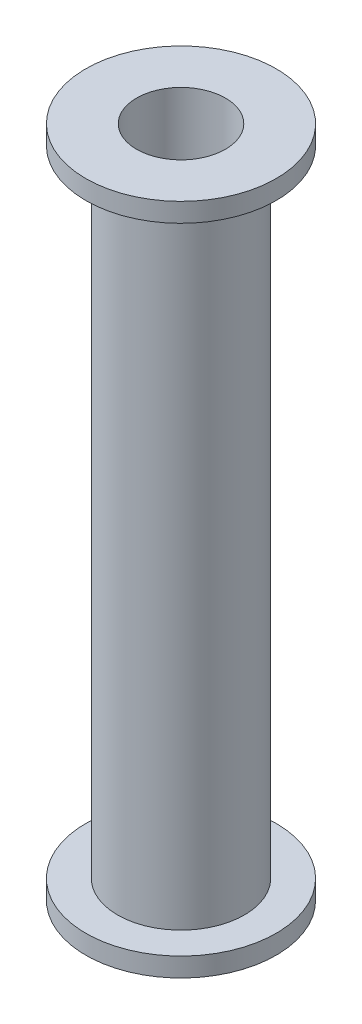
ISO-10303-21;
HEADER;
FILE_DESCRIPTION(('STEP AP214'),'2;1');
FILE_NAME('part.step','',(''),(''),'','','');
FILE_SCHEMA(('AUTOMOTIVE_DESIGN { 1 0 10303 214 1 1 1 1 }'));
ENDSEC;
DATA;
#1=APPLICATION_CONTEXT('core data for automotive mechanical design processes');
#2=APPLICATION_PROTOCOL_DEFINITION('international standard','automotive_design',2000,#1);
#3=PRODUCT_CONTEXT('',#1,'mechanical');
#4=PRODUCT('Part','Part','',(#3));
#5=PRODUCT_RELATED_PRODUCT_CATEGORY('part','',(#4));
#6=PRODUCT_DEFINITION_FORMATION('','',#4);
#7=PRODUCT_DEFINITION_CONTEXT('part definition',#1,'design');
#8=PRODUCT_DEFINITION('design','',#6,#7);
#9=PRODUCT_DEFINITION_SHAPE('','',#8);
#10=(LENGTH_UNIT() NAMED_UNIT(*) SI_UNIT(.MILLI.,.METRE.));
#11=(NAMED_UNIT(*) PLANE_ANGLE_UNIT() SI_UNIT($,.RADIAN.));
#12=(NAMED_UNIT(*) SI_UNIT($,.STERADIAN.) SOLID_ANGLE_UNIT());
#13=UNCERTAINTY_MEASURE_WITH_UNIT(LENGTH_MEASURE(1.E-05),#10,'distance_accuracy_value','');
#14=(GEOMETRIC_REPRESENTATION_CONTEXT(3) GLOBAL_UNCERTAINTY_ASSIGNED_CONTEXT((#13)) GLOBAL_UNIT_ASSIGNED_CONTEXT((#10,
#11,#12)) REPRESENTATION_CONTEXT('',''));
#15=CARTESIAN_POINT('',(0.,0.,0.));
#16=DIRECTION('',(0.,0.,1.));
#17=DIRECTION('',(1.,0.,0.));
#18=AXIS2_PLACEMENT_3D('',#15,#16,#17);
#19=CARTESIAN_POINT('',(0.,2.65,0.));
#20=DIRECTION('',(0.,1.,0.));
#21=DIRECTION('',(0.,0.,1.));
#22=AXIS2_PLACEMENT_3D('',#19,#20,#21);
#23=CYLINDRICAL_SURFACE('',#22,0.7);
#24=CARTESIAN_POINT('',(0.,5.3,0.));
#25=DIRECTION('',(0.,1.,0.));
#26=DIRECTION('',(0.,0.,1.));
#27=AXIS2_PLACEMENT_3D('',#24,#25,#26);
#28=CIRCLE('',#27,0.7);
#29=CARTESIAN_POINT('',(0.,5.3,0.7));
#30=VERTEX_POINT('',#29);
#31=EDGE_CURVE('E41',#30,#30,#28,.F.);
#32=ORIENTED_EDGE('',*,*,#31,.F.);
#33=EDGE_LOOP('',(#32));
#34=FACE_BOUND('',#33,.T.);
#35=CARTESIAN_POINT('',(0.,-5.3,0.));
#36=DIRECTION('',(0.,1.,0.));
#37=DIRECTION('',(0.,0.,1.));
#38=AXIS2_PLACEMENT_3D('',#35,#36,#37);
#39=CIRCLE('',#38,0.7);
#40=CARTESIAN_POINT('',(0.,-5.3,0.7));
#41=VERTEX_POINT('',#40);
#42=EDGE_CURVE('E19',#41,#41,#39,.T.);
#43=ORIENTED_EDGE('',*,*,#42,.F.);
#44=EDGE_LOOP('',(#43));
#45=FACE_BOUND('',#44,.T.);
#46=ADVANCED_FACE('F15',(#34,#45),#23,.F.);
#47=CARTESIAN_POINT('',(1.53,-5.3,-1.53));
#48=DIRECTION('',(0.,-1.,0.));
#49=DIRECTION('',(0.,0.,1.));
#50=AXIS2_PLACEMENT_3D('',#47,#48,#49);
#51=PLANE('',#50);
#52=ORIENTED_EDGE('',*,*,#42,.T.);
#53=EDGE_LOOP('',(#52));
#54=FACE_BOUND('',#53,.T.);
#55=CARTESIAN_POINT('',(0.,-5.3,0.));
#56=DIRECTION('',(0.,-1.,0.));
#57=DIRECTION('',(0.,0.,-1.));
#58=AXIS2_PLACEMENT_3D('',#55,#56,#57);
#59=CIRCLE('',#58,1.5);
#60=CARTESIAN_POINT('',(0.,-5.3,-1.5));
#61=VERTEX_POINT('',#60);
#62=EDGE_CURVE('E39',#61,#61,#59,.F.);
#63=ORIENTED_EDGE('',*,*,#62,.F.);
#64=EDGE_LOOP('',(#63));
#65=FACE_BOUND('',#64,.T.);
#66=ADVANCED_FACE('F48',(#54,#65),#51,.T.);
#67=CARTESIAN_POINT('',(-1.1,5.3,0.));
#68=DIRECTION('',(0.,1.,0.));
#69=DIRECTION('',(0.,0.,1.));
#70=AXIS2_PLACEMENT_3D('',#67,#68,#69);
#71=PLANE('',#70);
#72=ORIENTED_EDGE('',*,*,#31,.T.);
#73=EDGE_LOOP('',(#72));
#74=FACE_BOUND('',#73,.T.);
#75=CARTESIAN_POINT('',(0.,5.3,0.));
#76=DIRECTION('',(0.,1.,0.));
#77=DIRECTION('',(0.,0.,1.));
#78=AXIS2_PLACEMENT_3D('',#75,#76,#77);
#79=CIRCLE('',#78,1.5);
#80=CARTESIAN_POINT('',(0.,5.3,1.5));
#81=VERTEX_POINT('',#80);
#82=EDGE_CURVE('E36',#81,#81,#79,.F.);
#83=ORIENTED_EDGE('',*,*,#82,.F.);
#84=EDGE_LOOP('',(#83));
#85=FACE_BOUND('',#84,.T.);
#86=ADVANCED_FACE('F58',(#74,#85),#71,.T.);
#87=CARTESIAN_POINT('',(0.,-5.,0.));
#88=DIRECTION('',(0.,-1.,0.));
#89=DIRECTION('',(0.,0.,-1.));
#90=AXIS2_PLACEMENT_3D('',#87,#88,#89);
#91=CYLINDRICAL_SURFACE('',#90,1.5);
#92=CARTESIAN_POINT('',(0.,-5.,0.));
#93=DIRECTION('',(0.,-1.,0.));
#94=DIRECTION('',(0.,0.,-1.));
#95=AXIS2_PLACEMENT_3D('',#92,#93,#94);
#96=CIRCLE('',#95,1.5);
#97=CARTESIAN_POINT('',(0.,-5.,-1.5));
#98=VERTEX_POINT('',#97);
#99=EDGE_CURVE('E33',#98,#98,#96,.F.);
#100=ORIENTED_EDGE('',*,*,#99,.F.);
#101=EDGE_LOOP('',(#100));
#102=FACE_BOUND('',#101,.T.);
#103=ORIENTED_EDGE('',*,*,#62,.T.);
#104=EDGE_LOOP('',(#103));
#105=FACE_BOUND('',#104,.T.);
#106=ADVANCED_FACE('F74',(#102,#105),#91,.T.);
#107=CARTESIAN_POINT('',(0.,5.15,0.));
#108=DIRECTION('',(0.,1.,0.));
#109=DIRECTION('',(0.,0.,1.));
#110=AXIS2_PLACEMENT_3D('',#107,#108,#109);
#111=CYLINDRICAL_SURFACE('',#110,1.5);
#112=CARTESIAN_POINT('',(0.,5.,0.));
#113=DIRECTION('',(0.,1.,0.));
#114=DIRECTION('',(0.,0.,1.));
#115=AXIS2_PLACEMENT_3D('',#112,#113,#114);
#116=CIRCLE('',#115,1.5);
#117=CARTESIAN_POINT('',(0.,5.,1.5));
#118=VERTEX_POINT('',#117);
#119=EDGE_CURVE('E28',#118,#118,#116,.F.);
#120=ORIENTED_EDGE('',*,*,#119,.F.);
#121=EDGE_LOOP('',(#120));
#122=FACE_BOUND('',#121,.T.);
#123=ORIENTED_EDGE('',*,*,#82,.T.);
#124=EDGE_LOOP('',(#123));
#125=FACE_BOUND('',#124,.T.);
#126=ADVANCED_FACE('F72',(#122,#125),#111,.T.);
#127=CARTESIAN_POINT('',(1.53,-5.,1.53));
#128=DIRECTION('',(0.,1.,0.));
#129=DIRECTION('',(0.,0.,-1.));
#130=AXIS2_PLACEMENT_3D('',#127,#128,#129);
#131=PLANE('',#130);
#132=CARTESIAN_POINT('',(0.,-5.,0.));
#133=DIRECTION('',(0.,1.,0.));
#134=DIRECTION('',(0.,0.,1.));
#135=AXIS2_PLACEMENT_3D('',#132,#133,#134);
#136=CIRCLE('',#135,1.);
#137=CARTESIAN_POINT('',(0.,-5.,1.));
#138=VERTEX_POINT('',#137);
#139=EDGE_CURVE('E23',#138,#138,#136,.T.);
#140=ORIENTED_EDGE('',*,*,#139,.F.);
#141=EDGE_LOOP('',(#140));
#142=FACE_BOUND('',#141,.T.);
#143=ORIENTED_EDGE('',*,*,#99,.T.);
#144=EDGE_LOOP('',(#143));
#145=FACE_BOUND('',#144,.T.);
#146=ADVANCED_FACE('F17',(#142,#145),#131,.T.);
#147=CARTESIAN_POINT('',(-1.25,5.,0.));
#148=DIRECTION('',(0.,-1.,0.));
#149=DIRECTION('',(0.,0.,-1.));
#150=AXIS2_PLACEMENT_3D('',#147,#148,#149);
#151=PLANE('',#150);
#152=CARTESIAN_POINT('',(0.,5.,0.));
#153=DIRECTION('',(0.,1.,0.));
#154=DIRECTION('',(0.,0.,1.));
#155=AXIS2_PLACEMENT_3D('',#152,#153,#154);
#156=CIRCLE('',#155,1.);
#157=CARTESIAN_POINT('',(0.,5.,1.));
#158=VERTEX_POINT('',#157);
#159=EDGE_CURVE('E10',#158,#158,#156,.F.);
#160=ORIENTED_EDGE('',*,*,#159,.F.);
#161=EDGE_LOOP('',(#160));
#162=FACE_BOUND('',#161,.T.);
#163=ORIENTED_EDGE('',*,*,#119,.T.);
#164=EDGE_LOOP('',(#163));
#165=FACE_BOUND('',#164,.T.);
#166=ADVANCED_FACE('F63',(#162,#165),#151,.T.);
#167=CARTESIAN_POINT('',(0.,2.5,0.));
#168=DIRECTION('',(0.,1.,0.));
#169=DIRECTION('',(0.,0.,1.));
#170=AXIS2_PLACEMENT_3D('',#167,#168,#169);
#171=CYLINDRICAL_SURFACE('',#170,1.);
#172=ORIENTED_EDGE('',*,*,#159,.T.);
#173=EDGE_LOOP('',(#172));
#174=FACE_BOUND('',#173,.T.);
#175=ORIENTED_EDGE('',*,*,#139,.T.);
#176=EDGE_LOOP('',(#175));
#177=FACE_BOUND('',#176,.T.);
#178=ADVANCED_FACE('F61',(#174,#177),#171,.T.);
#179=CLOSED_SHELL('',(#46,#66,#86,#106,#126,#146,#166,#178));
#180=MANIFOLD_SOLID_BREP('B1',#179);
#181=ADVANCED_BREP_SHAPE_REPRESENTATION('',(#18,#180),#14);
#182=SHAPE_DEFINITION_REPRESENTATION(#9,#181);
ENDSEC;
END-ISO-10303-21;
